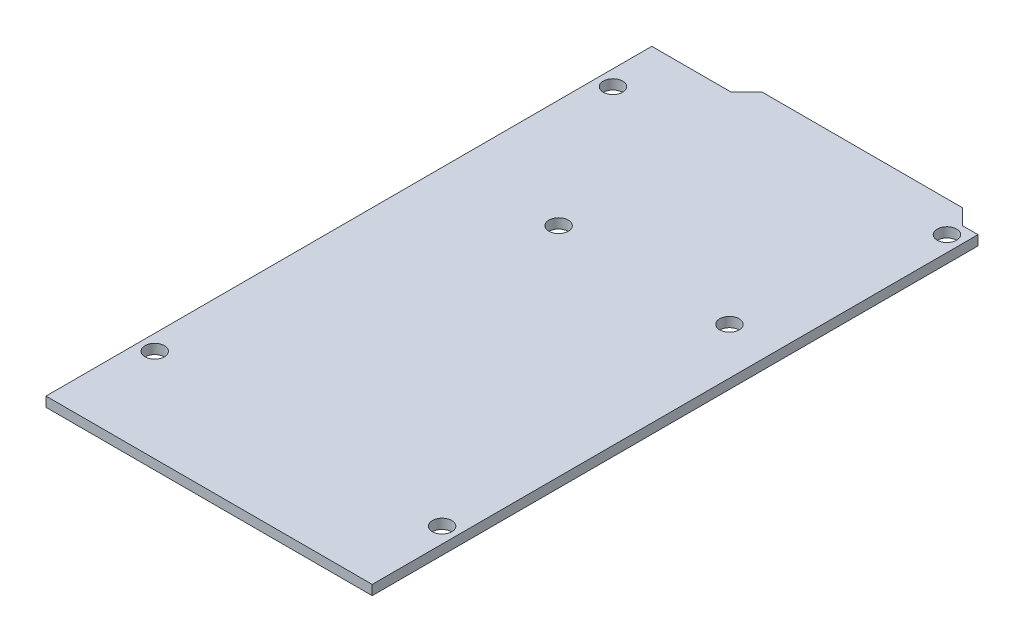
ISO-10303-21;
HEADER;
FILE_DESCRIPTION(('STEP AP214'),'2;1');
FILE_NAME('part.step','',(''),(''),'','','');
FILE_SCHEMA(('AUTOMOTIVE_DESIGN { 1 0 10303 214 1 1 1 1 }'));
ENDSEC;
DATA;
#1=APPLICATION_CONTEXT('core data for automotive mechanical design processes');
#2=APPLICATION_PROTOCOL_DEFINITION('international standard','automotive_design',2000,#1);
#3=PRODUCT_CONTEXT('',#1,'mechanical');
#4=PRODUCT('Part','Part','',(#3));
#5=PRODUCT_RELATED_PRODUCT_CATEGORY('part','',(#4));
#6=PRODUCT_DEFINITION_FORMATION('','',#4);
#7=PRODUCT_DEFINITION_CONTEXT('part definition',#1,'design');
#8=PRODUCT_DEFINITION('design','',#6,#7);
#9=PRODUCT_DEFINITION_SHAPE('','',#8);
#10=(LENGTH_UNIT() NAMED_UNIT(*) SI_UNIT(.MILLI.,.METRE.));
#11=(NAMED_UNIT(*) PLANE_ANGLE_UNIT() SI_UNIT($,.RADIAN.));
#12=(NAMED_UNIT(*) SI_UNIT($,.STERADIAN.) SOLID_ANGLE_UNIT());
#13=UNCERTAINTY_MEASURE_WITH_UNIT(LENGTH_MEASURE(1.E-05),#10,'distance_accuracy_value','');
#14=(GEOMETRIC_REPRESENTATION_CONTEXT(3) GLOBAL_UNCERTAINTY_ASSIGNED_CONTEXT((#13)) GLOBAL_UNIT_ASSIGNED_CONTEXT((#10,
#11,#12)) REPRESENTATION_CONTEXT('',''));
#15=CARTESIAN_POINT('',(0.,0.,0.));
#16=DIRECTION('',(0.,0.,1.));
#17=DIRECTION('',(1.,0.,0.));
#18=AXIS2_PLACEMENT_3D('',#15,#16,#17);
#19=CARTESIAN_POINT('',(0.,-1.6,0.));
#20=DIRECTION('',(1.,0.,0.));
#21=DIRECTION('',(0.,0.,-1.));
#22=AXIS2_PLACEMENT_3D('',#19,#20,#21);
#23=PLANE('',#22);
#24=DIRECTION('',(0.,0.,-1.));
#25=VECTOR('',#24,1.);
#26=CARTESIAN_POINT('',(0.,0.,0.));
#27=LINE('',#26,#25);
#28=CARTESIAN_POINT('',(0.,0.,0.));
#29=VERTEX_POINT('',#28);
#30=CARTESIAN_POINT('',(0.,0.,-99.06));
#31=VERTEX_POINT('',#30);
#32=EDGE_CURVE('E132',#29,#31,#27,.T.);
#33=ORIENTED_EDGE('',*,*,#32,.F.);
#34=DIRECTION('',(0.,1.,0.));
#35=VECTOR('',#34,1.);
#36=CARTESIAN_POINT('',(0.,-1.6,0.));
#37=LINE('',#36,#35);
#38=CARTESIAN_POINT('',(0.,-1.6,0.));
#39=VERTEX_POINT('',#38);
#40=EDGE_CURVE('E11',#39,#29,#37,.T.);
#41=ORIENTED_EDGE('',*,*,#40,.F.);
#42=DIRECTION('',(0.,0.,-1.));
#43=VECTOR('',#42,1.);
#44=CARTESIAN_POINT('',(0.,-1.6,0.));
#45=LINE('',#44,#43);
#46=CARTESIAN_POINT('',(0.,-1.6,-99.06));
#47=VERTEX_POINT('',#46);
#48=EDGE_CURVE('E153',#39,#47,#45,.T.);
#49=ORIENTED_EDGE('',*,*,#48,.T.);
#50=DIRECTION('',(0.,1.,0.));
#51=VECTOR('',#50,1.);
#52=CARTESIAN_POINT('',(0.,-1.6,-99.06));
#53=LINE('',#52,#51);
#54=EDGE_CURVE('E38',#47,#31,#53,.T.);
#55=ORIENTED_EDGE('',*,*,#54,.T.);
#56=EDGE_LOOP('',(#33,#41,#49,#55));
#57=FACE_BOUND('',#56,.T.);
#58=ADVANCED_FACE('F35',(#57),#23,.T.);
#59=CARTESIAN_POINT('',(0.,-1.6,0.));
#60=DIRECTION('',(0.,0.,1.));
#61=DIRECTION('',(1.,0.,0.));
#62=AXIS2_PLACEMENT_3D('',#59,#60,#61);
#63=PLANE('',#62);
#64=DIRECTION('',(1.,0.,0.));
#65=VECTOR('',#64,1.);
#66=CARTESIAN_POINT('',(0.,0.,0.));
#67=LINE('',#66,#65);
#68=CARTESIAN_POINT('',(-53.34,0.,0.));
#69=VERTEX_POINT('',#68);
#70=EDGE_CURVE('E151',#69,#29,#67,.T.);
#71=ORIENTED_EDGE('',*,*,#70,.F.);
#72=DIRECTION('',(0.,1.,0.));
#73=VECTOR('',#72,1.);
#74=CARTESIAN_POINT('',(-53.34,-1.6,0.));
#75=LINE('',#74,#73);
#76=CARTESIAN_POINT('',(-53.34,-1.6,0.));
#77=VERTEX_POINT('',#76);
#78=EDGE_CURVE('E44',#77,#69,#75,.T.);
#79=ORIENTED_EDGE('',*,*,#78,.F.);
#80=DIRECTION('',(1.,0.,0.));
#81=VECTOR('',#80,1.);
#82=CARTESIAN_POINT('',(0.,-1.6,0.));
#83=LINE('',#82,#81);
#84=EDGE_CURVE('E122',#77,#39,#83,.T.);
#85=ORIENTED_EDGE('',*,*,#84,.T.);
#86=ORIENTED_EDGE('',*,*,#40,.T.);
#87=EDGE_LOOP('',(#71,#79,#85,#86));
#88=FACE_BOUND('',#87,.T.);
#89=ADVANCED_FACE('F165',(#88),#63,.T.);
#90=CARTESIAN_POINT('',(-53.34,-1.6,0.));
#91=DIRECTION('',(-1.,0.,0.));
#92=DIRECTION('',(0.,0.,1.));
#93=AXIS2_PLACEMENT_3D('',#90,#91,#92);
#94=PLANE('',#93);
#95=DIRECTION('',(0.,0.,1.));
#96=VECTOR('',#95,1.);
#97=CARTESIAN_POINT('',(-53.34,0.,0.));
#98=LINE('',#97,#96);
#99=CARTESIAN_POINT('',(-53.34,0.,-99.06));
#100=VERTEX_POINT('',#99);
#101=EDGE_CURVE('E109',#100,#69,#98,.T.);
#102=ORIENTED_EDGE('',*,*,#101,.F.);
#103=DIRECTION('',(0.,1.,0.));
#104=VECTOR('',#103,1.);
#105=CARTESIAN_POINT('',(-53.34,-1.6,-99.06));
#106=LINE('',#105,#104);
#107=CARTESIAN_POINT('',(-53.34,-1.6,-99.06));
#108=VERTEX_POINT('',#107);
#109=EDGE_CURVE('E104',#108,#100,#106,.T.);
#110=ORIENTED_EDGE('',*,*,#109,.F.);
#111=DIRECTION('',(0.,0.,1.));
#112=VECTOR('',#111,1.);
#113=CARTESIAN_POINT('',(-53.34,-1.6,0.));
#114=LINE('',#113,#112);
#115=EDGE_CURVE('E107',#108,#77,#114,.T.);
#116=ORIENTED_EDGE('',*,*,#115,.T.);
#117=ORIENTED_EDGE('',*,*,#78,.T.);
#118=EDGE_LOOP('',(#102,#110,#116,#117));
#119=FACE_BOUND('',#118,.T.);
#120=ADVANCED_FACE('F106',(#119),#94,.T.);
#121=CARTESIAN_POINT('',(-53.34,-1.6,-99.06));
#122=DIRECTION('',(0.,0.,-1.));
#123=DIRECTION('',(-1.,0.,0.));
#124=AXIS2_PLACEMENT_3D('',#121,#122,#123);
#125=PLANE('',#124);
#126=DIRECTION('',(-1.,0.,0.));
#127=VECTOR('',#126,1.);
#128=CARTESIAN_POINT('',(-53.34,0.,-99.06));
#129=LINE('',#128,#127);
#130=CARTESIAN_POINT('',(-40.386,0.,-99.06));
#131=VERTEX_POINT('',#130);
#132=EDGE_CURVE('E148',#131,#100,#129,.T.);
#133=ORIENTED_EDGE('',*,*,#132,.F.);
#134=DIRECTION('',(0.,1.,0.));
#135=VECTOR('',#134,1.);
#136=CARTESIAN_POINT('',(-40.386,-1.6,-99.06));
#137=LINE('',#136,#135);
#138=CARTESIAN_POINT('',(-40.386,-1.6,-99.06));
#139=VERTEX_POINT('',#138);
#140=EDGE_CURVE('E114',#139,#131,#137,.T.);
#141=ORIENTED_EDGE('',*,*,#140,.F.);
#142=DIRECTION('',(-1.,0.,0.));
#143=VECTOR('',#142,1.);
#144=CARTESIAN_POINT('',(-53.34,-1.6,-99.06));
#145=LINE('',#144,#143);
#146=EDGE_CURVE('E120',#139,#108,#145,.T.);
#147=ORIENTED_EDGE('',*,*,#146,.T.);
#148=ORIENTED_EDGE('',*,*,#109,.T.);
#149=EDGE_LOOP('',(#133,#141,#147,#148));
#150=FACE_BOUND('',#149,.T.);
#151=ADVANCED_FACE('F124',(#150),#125,.T.);
#152=CARTESIAN_POINT('',(-40.386,-1.6,-99.06));
#153=DIRECTION('',(-0.707106781186549,0.,-0.707106781186546));
#154=DIRECTION('',(-0.707106781186546,0.,0.707106781186549));
#155=AXIS2_PLACEMENT_3D('',#152,#153,#154);
#156=PLANE('',#155);
#157=DIRECTION('',(-0.707106781186546,0.,0.707106781186549));
#158=VECTOR('',#157,1.);
#159=CARTESIAN_POINT('',(-40.386,0.,-99.06));
#160=LINE('',#159,#158);
#161=CARTESIAN_POINT('',(-37.846,0.,-101.6));
#162=VERTEX_POINT('',#161);
#163=EDGE_CURVE('E145',#162,#131,#160,.T.);
#164=ORIENTED_EDGE('',*,*,#163,.F.);
#165=DIRECTION('',(0.,1.,0.));
#166=VECTOR('',#165,1.);
#167=CARTESIAN_POINT('',(-37.846,-1.6,-101.6));
#168=LINE('',#167,#166);
#169=CARTESIAN_POINT('',(-37.846,-1.6,-101.6));
#170=VERTEX_POINT('',#169);
#171=EDGE_CURVE('E157',#170,#162,#168,.T.);
#172=ORIENTED_EDGE('',*,*,#171,.F.);
#173=DIRECTION('',(-0.707106781186546,0.,0.707106781186549));
#174=VECTOR('',#173,1.);
#175=CARTESIAN_POINT('',(-40.386,-1.6,-99.06));
#176=LINE('',#175,#174);
#177=EDGE_CURVE('E125',#170,#139,#176,.T.);
#178=ORIENTED_EDGE('',*,*,#177,.T.);
#179=ORIENTED_EDGE('',*,*,#140,.T.);
#180=EDGE_LOOP('',(#164,#172,#178,#179));
#181=FACE_BOUND('',#180,.T.);
#182=ADVANCED_FACE('F178',(#181),#156,.T.);
#183=CARTESIAN_POINT('',(-5.07999999999997,-1.6,-101.6));
#184=DIRECTION('',(0.,0.,-1.));
#185=DIRECTION('',(-1.,0.,0.));
#186=AXIS2_PLACEMENT_3D('',#183,#184,#185);
#187=PLANE('',#186);
#188=DIRECTION('',(-1.,0.,0.));
#189=VECTOR('',#188,1.);
#190=CARTESIAN_POINT('',(-5.07999999999997,0.,-101.6));
#191=LINE('',#190,#189);
#192=CARTESIAN_POINT('',(-5.07999999999997,0.,-101.6));
#193=VERTEX_POINT('',#192);
#194=EDGE_CURVE('E142',#193,#162,#191,.T.);
#195=ORIENTED_EDGE('',*,*,#194,.F.);
#196=DIRECTION('',(0.,1.,0.));
#197=VECTOR('',#196,1.);
#198=CARTESIAN_POINT('',(-5.07999999999997,-1.6,-101.6));
#199=LINE('',#198,#197);
#200=CARTESIAN_POINT('',(-5.07999999999997,-1.6,-101.6));
#201=VERTEX_POINT('',#200);
#202=EDGE_CURVE('E159',#201,#193,#199,.T.);
#203=ORIENTED_EDGE('',*,*,#202,.F.);
#204=DIRECTION('',(-1.,0.,0.));
#205=VECTOR('',#204,1.);
#206=CARTESIAN_POINT('',(-5.07999999999997,-1.6,-101.6));
#207=LINE('',#206,#205);
#208=EDGE_CURVE('E127',#201,#170,#207,.T.);
#209=ORIENTED_EDGE('',*,*,#208,.T.);
#210=ORIENTED_EDGE('',*,*,#171,.T.);
#211=EDGE_LOOP('',(#195,#203,#209,#210));
#212=FACE_BOUND('',#211,.T.);
#213=ADVANCED_FACE('F181',(#212),#187,.T.);
#214=CARTESIAN_POINT('',(-5.07999999999997,-1.6,-101.6));
#215=DIRECTION('',(0.707106781186548,0.,-0.707106781186547));
#216=DIRECTION('',(-0.707106781186547,0.,-0.707106781186548));
#217=AXIS2_PLACEMENT_3D('',#214,#215,#216);
#218=PLANE('',#217);
#219=DIRECTION('',(-0.707106781186547,0.,-0.707106781186548));
#220=VECTOR('',#219,1.);
#221=CARTESIAN_POINT('',(-5.07999999999997,0.,-101.6));
#222=LINE('',#221,#220);
#223=CARTESIAN_POINT('',(-2.54,0.,-99.06));
#224=VERTEX_POINT('',#223);
#225=EDGE_CURVE('E139',#224,#193,#222,.T.);
#226=ORIENTED_EDGE('',*,*,#225,.F.);
#227=DIRECTION('',(0.,1.,0.));
#228=VECTOR('',#227,1.);
#229=CARTESIAN_POINT('',(-2.54,-1.6,-99.06));
#230=LINE('',#229,#228);
#231=CARTESIAN_POINT('',(-2.54,-1.6,-99.06));
#232=VERTEX_POINT('',#231);
#233=EDGE_CURVE('E160',#232,#224,#230,.T.);
#234=ORIENTED_EDGE('',*,*,#233,.F.);
#235=DIRECTION('',(-0.707106781186547,0.,-0.707106781186548));
#236=VECTOR('',#235,1.);
#237=CARTESIAN_POINT('',(-5.07999999999997,-1.6,-101.6));
#238=LINE('',#237,#236);
#239=EDGE_CURVE('E267',#232,#201,#238,.T.);
#240=ORIENTED_EDGE('',*,*,#239,.T.);
#241=ORIENTED_EDGE('',*,*,#202,.T.);
#242=EDGE_LOOP('',(#226,#234,#240,#241));
#243=FACE_BOUND('',#242,.T.);
#244=ADVANCED_FACE('F185',(#243),#218,.T.);
#245=CARTESIAN_POINT('',(-2.54,-1.6,-99.06));
#246=DIRECTION('',(0.,0.,-1.));
#247=DIRECTION('',(-1.,0.,0.));
#248=AXIS2_PLACEMENT_3D('',#245,#246,#247);
#249=PLANE('',#248);
#250=DIRECTION('',(-1.,0.,0.));
#251=VECTOR('',#250,1.);
#252=CARTESIAN_POINT('',(-2.54,0.,-99.06));
#253=LINE('',#252,#251);
#254=EDGE_CURVE('E135',#31,#224,#253,.T.);
#255=ORIENTED_EDGE('',*,*,#254,.F.);
#256=ORIENTED_EDGE('',*,*,#54,.F.);
#257=DIRECTION('',(-1.,0.,0.));
#258=VECTOR('',#257,1.);
#259=CARTESIAN_POINT('',(-2.54,-1.6,-99.06));
#260=LINE('',#259,#258);
#261=EDGE_CURVE('E265',#47,#232,#260,.T.);
#262=ORIENTED_EDGE('',*,*,#261,.T.);
#263=ORIENTED_EDGE('',*,*,#233,.T.);
#264=EDGE_LOOP('',(#255,#256,#262,#263));
#265=FACE_BOUND('',#264,.T.);
#266=ADVANCED_FACE('F162',(#265),#249,.T.);
#267=CARTESIAN_POINT('',(0.,-1.6,0.));
#268=DIRECTION('',(0.,-1.,0.));
#269=DIRECTION('',(0.,0.,-1.));
#270=AXIS2_PLACEMENT_3D('',#267,#268,#269);
#271=PLANE('',#270);
#272=CARTESIAN_POINT('',(-50.8,-1.6,-90.17));
#273=DIRECTION('',(0.,1.,0.));
#274=DIRECTION('',(0.,0.,1.));
#275=AXIS2_PLACEMENT_3D('',#272,#273,#274);
#276=CIRCLE('',#275,1.5875);
#277=CARTESIAN_POINT('',(-50.8,-1.6,-88.5825));
#278=VERTEX_POINT('',#277);
#279=EDGE_CURVE('E228',#278,#278,#276,.T.);
#280=ORIENTED_EDGE('',*,*,#279,.T.);
#281=EDGE_LOOP('',(#280));
#282=FACE_BOUND('',#281,.T.);
#283=CARTESIAN_POINT('',(-2.54,-1.6,-96.52));
#284=DIRECTION('',(0.,1.,0.));
#285=DIRECTION('',(0.,0.,1.));
#286=AXIS2_PLACEMENT_3D('',#283,#284,#285);
#287=CIRCLE('',#286,1.5875);
#288=CARTESIAN_POINT('',(-2.54,-1.6,-94.9325));
#289=VERTEX_POINT('',#288);
#290=EDGE_CURVE('E236',#289,#289,#287,.T.);
#291=ORIENTED_EDGE('',*,*,#290,.T.);
#292=EDGE_LOOP('',(#291));
#293=FACE_BOUND('',#292,.T.);
#294=CARTESIAN_POINT('',(-50.8,-1.6,-15.24));
#295=DIRECTION('',(0.,1.,0.));
#296=DIRECTION('',(0.,0.,1.));
#297=AXIS2_PLACEMENT_3D('',#294,#295,#296);
#298=CIRCLE('',#297,1.5875);
#299=CARTESIAN_POINT('',(-50.8,-1.6,-13.6525));
#300=VERTEX_POINT('',#299);
#301=EDGE_CURVE('E242',#300,#300,#298,.T.);
#302=ORIENTED_EDGE('',*,*,#301,.T.);
#303=EDGE_LOOP('',(#302));
#304=FACE_BOUND('',#303,.T.);
#305=CARTESIAN_POINT('',(-2.54,-1.6,-13.97));
#306=DIRECTION('',(0.,1.,0.));
#307=DIRECTION('',(0.,0.,1.));
#308=AXIS2_PLACEMENT_3D('',#305,#306,#307);
#309=CIRCLE('',#308,1.5875);
#310=CARTESIAN_POINT('',(-2.54,-1.6,-12.3825));
#311=VERTEX_POINT('',#310);
#312=EDGE_CURVE('E248',#311,#311,#309,.T.);
#313=ORIENTED_EDGE('',*,*,#312,.T.);
#314=EDGE_LOOP('',(#313));
#315=FACE_BOUND('',#314,.T.);
#316=CARTESIAN_POINT('',(-35.56,-1.6,-66.04));
#317=DIRECTION('',(0.,1.,0.));
#318=DIRECTION('',(0.,0.,1.));
#319=AXIS2_PLACEMENT_3D('',#316,#317,#318);
#320=CIRCLE('',#319,1.5875);
#321=CARTESIAN_POINT('',(-35.56,-1.6,-64.4525));
#322=VERTEX_POINT('',#321);
#323=EDGE_CURVE('E254',#322,#322,#320,.T.);
#324=ORIENTED_EDGE('',*,*,#323,.T.);
#325=EDGE_LOOP('',(#324));
#326=FACE_BOUND('',#325,.T.);
#327=CARTESIAN_POINT('',(-7.62,-1.6,-66.04));
#328=DIRECTION('',(0.,1.,0.));
#329=DIRECTION('',(0.,0.,1.));
#330=AXIS2_PLACEMENT_3D('',#327,#328,#329);
#331=CIRCLE('',#330,1.5875);
#332=CARTESIAN_POINT('',(-7.62,-1.6,-64.4525));
#333=VERTEX_POINT('',#332);
#334=EDGE_CURVE('E136',#333,#333,#331,.T.);
#335=ORIENTED_EDGE('',*,*,#334,.T.);
#336=EDGE_LOOP('',(#335));
#337=FACE_BOUND('',#336,.T.);
#338=ORIENTED_EDGE('',*,*,#48,.F.);
#339=ORIENTED_EDGE('',*,*,#84,.F.);
#340=ORIENTED_EDGE('',*,*,#115,.F.);
#341=ORIENTED_EDGE('',*,*,#146,.F.);
#342=ORIENTED_EDGE('',*,*,#177,.F.);
#343=ORIENTED_EDGE('',*,*,#208,.F.);
#344=ORIENTED_EDGE('',*,*,#239,.F.);
#345=ORIENTED_EDGE('',*,*,#261,.F.);
#346=EDGE_LOOP('',(#338,#339,#340,#341,#342,#343,#344,#345));
#347=FACE_BOUND('',#346,.T.);
#348=ADVANCED_FACE('F118',(#282,#293,#304,#315,#326,#337,#347),#271,.T.);
#349=CARTESIAN_POINT('',(0.,0.,0.));
#350=DIRECTION('',(0.,-1.,0.));
#351=DIRECTION('',(0.,0.,-1.));
#352=AXIS2_PLACEMENT_3D('',#349,#350,#351);
#353=PLANE('',#352);
#354=CARTESIAN_POINT('',(-50.8,0.,-90.17));
#355=DIRECTION('',(0.,1.,0.));
#356=DIRECTION('',(0.,0.,1.));
#357=AXIS2_PLACEMENT_3D('',#354,#355,#356);
#358=CIRCLE('',#357,1.5875);
#359=CARTESIAN_POINT('',(-50.8,0.,-88.5825));
#360=VERTEX_POINT('',#359);
#361=EDGE_CURVE('E231',#360,#360,#358,.T.);
#362=ORIENTED_EDGE('',*,*,#361,.F.);
#363=EDGE_LOOP('',(#362));
#364=FACE_BOUND('',#363,.T.);
#365=CARTESIAN_POINT('',(-2.54,0.,-96.52));
#366=DIRECTION('',(0.,1.,0.));
#367=DIRECTION('',(0.,0.,1.));
#368=AXIS2_PLACEMENT_3D('',#365,#366,#367);
#369=CIRCLE('',#368,1.5875);
#370=CARTESIAN_POINT('',(-2.54,0.,-94.9325));
#371=VERTEX_POINT('',#370);
#372=EDGE_CURVE('E233',#371,#371,#369,.T.);
#373=ORIENTED_EDGE('',*,*,#372,.F.);
#374=EDGE_LOOP('',(#373));
#375=FACE_BOUND('',#374,.T.);
#376=CARTESIAN_POINT('',(-50.8,0.,-15.24));
#377=DIRECTION('',(0.,1.,0.));
#378=DIRECTION('',(0.,0.,1.));
#379=AXIS2_PLACEMENT_3D('',#376,#377,#378);
#380=CIRCLE('',#379,1.5875);
#381=CARTESIAN_POINT('',(-50.8,0.,-13.6525));
#382=VERTEX_POINT('',#381);
#383=EDGE_CURVE('E239',#382,#382,#380,.T.);
#384=ORIENTED_EDGE('',*,*,#383,.F.);
#385=EDGE_LOOP('',(#384));
#386=FACE_BOUND('',#385,.T.);
#387=CARTESIAN_POINT('',(-2.54,0.,-13.97));
#388=DIRECTION('',(0.,1.,0.));
#389=DIRECTION('',(0.,0.,1.));
#390=AXIS2_PLACEMENT_3D('',#387,#388,#389);
#391=CIRCLE('',#390,1.5875);
#392=CARTESIAN_POINT('',(-2.54,0.,-12.3825));
#393=VERTEX_POINT('',#392);
#394=EDGE_CURVE('E245',#393,#393,#391,.T.);
#395=ORIENTED_EDGE('',*,*,#394,.F.);
#396=EDGE_LOOP('',(#395));
#397=FACE_BOUND('',#396,.T.);
#398=CARTESIAN_POINT('',(-35.56,0.,-66.04));
#399=DIRECTION('',(0.,1.,0.));
#400=DIRECTION('',(0.,0.,1.));
#401=AXIS2_PLACEMENT_3D('',#398,#399,#400);
#402=CIRCLE('',#401,1.5875);
#403=CARTESIAN_POINT('',(-35.56,0.,-64.4525));
#404=VERTEX_POINT('',#403);
#405=EDGE_CURVE('E251',#404,#404,#402,.T.);
#406=ORIENTED_EDGE('',*,*,#405,.F.);
#407=EDGE_LOOP('',(#406));
#408=FACE_BOUND('',#407,.T.);
#409=CARTESIAN_POINT('',(-7.62,0.,-66.04));
#410=DIRECTION('',(0.,1.,0.));
#411=DIRECTION('',(0.,0.,1.));
#412=AXIS2_PLACEMENT_3D('',#409,#410,#411);
#413=CIRCLE('',#412,1.5875);
#414=CARTESIAN_POINT('',(-7.62,0.,-64.4525));
#415=VERTEX_POINT('',#414);
#416=EDGE_CURVE('E257',#415,#415,#413,.T.);
#417=ORIENTED_EDGE('',*,*,#416,.F.);
#418=EDGE_LOOP('',(#417));
#419=FACE_BOUND('',#418,.T.);
#420=ORIENTED_EDGE('',*,*,#32,.T.);
#421=ORIENTED_EDGE('',*,*,#254,.T.);
#422=ORIENTED_EDGE('',*,*,#225,.T.);
#423=ORIENTED_EDGE('',*,*,#194,.T.);
#424=ORIENTED_EDGE('',*,*,#163,.T.);
#425=ORIENTED_EDGE('',*,*,#132,.T.);
#426=ORIENTED_EDGE('',*,*,#101,.T.);
#427=ORIENTED_EDGE('',*,*,#70,.T.);
#428=EDGE_LOOP('',(#420,#421,#422,#423,#424,#425,#426,#427));
#429=FACE_BOUND('',#428,.T.);
#430=ADVANCED_FACE('F164',(#364,#375,#386,#397,#408,#419,#429),#353,.F.);
#431=CARTESIAN_POINT('',(-7.62,-1.6,-66.04));
#432=DIRECTION('',(0.,1.,0.));
#433=DIRECTION('',(0.,0.,1.));
#434=AXIS2_PLACEMENT_3D('',#431,#432,#433);
#435=CYLINDRICAL_SURFACE('',#434,1.5875);
#436=ORIENTED_EDGE('',*,*,#334,.F.);
#437=EDGE_LOOP('',(#436));
#438=FACE_BOUND('',#437,.T.);
#439=ORIENTED_EDGE('',*,*,#416,.T.);
#440=EDGE_LOOP('',(#439));
#441=FACE_BOUND('',#440,.T.);
#442=ADVANCED_FACE('F197',(#438,#441),#435,.F.);
#443=CARTESIAN_POINT('',(-35.56,-1.6,-66.04));
#444=DIRECTION('',(0.,1.,0.));
#445=DIRECTION('',(0.,0.,1.));
#446=AXIS2_PLACEMENT_3D('',#443,#444,#445);
#447=CYLINDRICAL_SURFACE('',#446,1.5875);
#448=ORIENTED_EDGE('',*,*,#323,.F.);
#449=EDGE_LOOP('',(#448));
#450=FACE_BOUND('',#449,.T.);
#451=ORIENTED_EDGE('',*,*,#405,.T.);
#452=EDGE_LOOP('',(#451));
#453=FACE_BOUND('',#452,.T.);
#454=ADVANCED_FACE('F204',(#450,#453),#447,.F.);
#455=CARTESIAN_POINT('',(-2.54,-1.6,-13.97));
#456=DIRECTION('',(0.,1.,0.));
#457=DIRECTION('',(0.,0.,1.));
#458=AXIS2_PLACEMENT_3D('',#455,#456,#457);
#459=CYLINDRICAL_SURFACE('',#458,1.5875);
#460=ORIENTED_EDGE('',*,*,#312,.F.);
#461=EDGE_LOOP('',(#460));
#462=FACE_BOUND('',#461,.T.);
#463=ORIENTED_EDGE('',*,*,#394,.T.);
#464=EDGE_LOOP('',(#463));
#465=FACE_BOUND('',#464,.T.);
#466=ADVANCED_FACE('F208',(#462,#465),#459,.F.);
#467=CARTESIAN_POINT('',(-50.8,-1.6,-15.24));
#468=DIRECTION('',(0.,1.,0.));
#469=DIRECTION('',(0.,0.,1.));
#470=AXIS2_PLACEMENT_3D('',#467,#468,#469);
#471=CYLINDRICAL_SURFACE('',#470,1.5875);
#472=ORIENTED_EDGE('',*,*,#301,.F.);
#473=EDGE_LOOP('',(#472));
#474=FACE_BOUND('',#473,.T.);
#475=ORIENTED_EDGE('',*,*,#383,.T.);
#476=EDGE_LOOP('',(#475));
#477=FACE_BOUND('',#476,.T.);
#478=ADVANCED_FACE('F212',(#474,#477),#471,.F.);
#479=CARTESIAN_POINT('',(-2.54,-1.6,-96.52));
#480=DIRECTION('',(0.,1.,0.));
#481=DIRECTION('',(0.,0.,1.));
#482=AXIS2_PLACEMENT_3D('',#479,#480,#481);
#483=CYLINDRICAL_SURFACE('',#482,1.5875);
#484=ORIENTED_EDGE('',*,*,#290,.F.);
#485=EDGE_LOOP('',(#484));
#486=FACE_BOUND('',#485,.T.);
#487=ORIENTED_EDGE('',*,*,#372,.T.);
#488=EDGE_LOOP('',(#487));
#489=FACE_BOUND('',#488,.T.);
#490=ADVANCED_FACE('F216',(#486,#489),#483,.F.);
#491=CARTESIAN_POINT('',(-50.8,-1.6,-90.17));
#492=DIRECTION('',(0.,1.,0.));
#493=DIRECTION('',(0.,0.,1.));
#494=AXIS2_PLACEMENT_3D('',#491,#492,#493);
#495=CYLINDRICAL_SURFACE('',#494,1.5875);
#496=ORIENTED_EDGE('',*,*,#279,.F.);
#497=EDGE_LOOP('',(#496));
#498=FACE_BOUND('',#497,.T.);
#499=ORIENTED_EDGE('',*,*,#361,.T.);
#500=EDGE_LOOP('',(#499));
#501=FACE_BOUND('',#500,.T.);
#502=ADVANCED_FACE('F220',(#498,#501),#495,.F.);
#503=CLOSED_SHELL('',(#58,#89,#120,#151,#182,#213,#244,#266,#348,#430,#442,#454,#466,#478,#490,#502));
#504=MANIFOLD_SOLID_BREP('B2',#503);
#505=ADVANCED_BREP_SHAPE_REPRESENTATION('',(#18,#504),#14);
#506=SHAPE_DEFINITION_REPRESENTATION(#9,#505);
ENDSEC;
END-ISO-10303-21;
